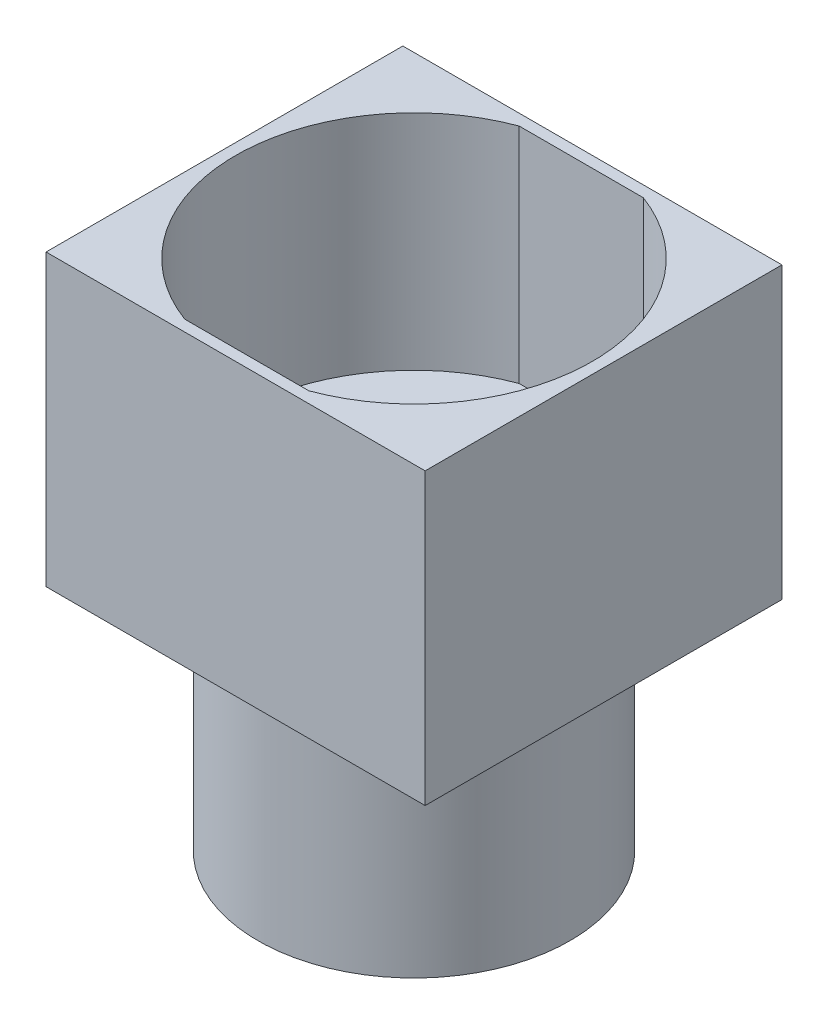
ISO-10303-21;
HEADER;
FILE_DESCRIPTION(('STEP AP214'),'2;1');
FILE_NAME('part.step','',(''),(''),'','','');
FILE_SCHEMA(('AUTOMOTIVE_DESIGN { 1 0 10303 214 1 1 1 1 }'));
ENDSEC;
DATA;
#1=APPLICATION_CONTEXT('core data for automotive mechanical design processes');
#2=APPLICATION_PROTOCOL_DEFINITION('international standard','automotive_design',2000,#1);
#3=PRODUCT_CONTEXT('',#1,'mechanical');
#4=PRODUCT('Part','Part','',(#3));
#5=PRODUCT_RELATED_PRODUCT_CATEGORY('part','',(#4));
#6=PRODUCT_DEFINITION_FORMATION('','',#4);
#7=PRODUCT_DEFINITION_CONTEXT('part definition',#1,'design');
#8=PRODUCT_DEFINITION('design','',#6,#7);
#9=PRODUCT_DEFINITION_SHAPE('','',#8);
#10=(LENGTH_UNIT() NAMED_UNIT(*) SI_UNIT(.MILLI.,.METRE.));
#11=(NAMED_UNIT(*) PLANE_ANGLE_UNIT() SI_UNIT($,.RADIAN.));
#12=(NAMED_UNIT(*) SI_UNIT($,.STERADIAN.) SOLID_ANGLE_UNIT());
#13=UNCERTAINTY_MEASURE_WITH_UNIT(LENGTH_MEASURE(1.E-05),#10,'distance_accuracy_value','');
#14=(GEOMETRIC_REPRESENTATION_CONTEXT(3) GLOBAL_UNCERTAINTY_ASSIGNED_CONTEXT((#13)) GLOBAL_UNIT_ASSIGNED_CONTEXT((#10,
#11,#12)) REPRESENTATION_CONTEXT('',''));
#15=CARTESIAN_POINT('',(0.,0.,0.));
#16=DIRECTION('',(0.,0.,1.));
#17=DIRECTION('',(1.,0.,0.));
#18=AXIS2_PLACEMENT_3D('',#15,#16,#17);
#19=CARTESIAN_POINT('',(0.,13.,0.));
#20=DIRECTION('',(0.,-1.,0.));
#21=DIRECTION('',(0.,0.,-1.));
#22=AXIS2_PLACEMENT_3D('',#19,#20,#21);
#23=CYLINDRICAL_SURFACE('',#22,7.);
#24=CARTESIAN_POINT('',(0.,0.,0.));
#25=DIRECTION('',(0.,1.,0.));
#26=DIRECTION('',(0.,0.,1.));
#27=AXIS2_PLACEMENT_3D('',#24,#25,#26);
#28=CIRCLE('',#27,7.);
#29=CARTESIAN_POINT('',(0.,0.,-7.));
#30=VERTEX_POINT('',#29);
#31=EDGE_CURVE('E38',#30,#30,#28,.T.);
#32=CARTESIAN_POINT('',(0.,10.,0.));
#33=DIRECTION('',(0.,1.,0.));
#34=DIRECTION('',(0.,0.,1.));
#35=AXIS2_PLACEMENT_3D('',#32,#33,#34);
#36=CIRCLE('',#35,7.);
#37=CARTESIAN_POINT('',(0.,10.,-7.));
#38=VERTEX_POINT('',#37);
#39=EDGE_CURVE('E11',#38,#38,#36,.T.);
#40=CARTESIAN_POINT('',(0.,0.,-7.));
#41=CARTESIAN_POINT('',(0.,0.104166666666667,-7.));
#42=CARTESIAN_POINT('',(0.,0.208333333333334,-7.));
#43=CARTESIAN_POINT('',(0.,0.416666666666667,-7.));
#44=CARTESIAN_POINT('',(0.,0.520833333333334,-7.));
#45=CARTESIAN_POINT('',(0.,0.729166666666667,-7.));
#46=CARTESIAN_POINT('',(0.,0.833333333333333,-7.));
#47=CARTESIAN_POINT('',(0.,1.04166666666667,-7.));
#48=CARTESIAN_POINT('',(0.,1.14583333333333,-7.));
#49=CARTESIAN_POINT('',(0.,1.35416666666667,-7.));
#50=CARTESIAN_POINT('',(0.,1.45833333333333,-7.));
#51=CARTESIAN_POINT('',(0.,1.66666666666667,-7.));
#52=CARTESIAN_POINT('',(0.,1.77083333333333,-7.));
#53=CARTESIAN_POINT('',(0.,1.97916666666667,-7.));
#54=CARTESIAN_POINT('',(0.,2.08333333333333,-7.));
#55=CARTESIAN_POINT('',(0.,2.29166666666667,-7.));
#56=CARTESIAN_POINT('',(0.,2.39583333333333,-7.));
#57=CARTESIAN_POINT('',(0.,2.60416666666667,-7.));
#58=CARTESIAN_POINT('',(0.,2.70833333333333,-7.));
#59=CARTESIAN_POINT('',(0.,2.91666666666667,-7.));
#60=CARTESIAN_POINT('',(0.,3.02083333333333,-7.));
#61=CARTESIAN_POINT('',(0.,3.22916666666667,-7.));
#62=CARTESIAN_POINT('',(0.,3.33333333333333,-7.));
#63=CARTESIAN_POINT('',(0.,3.54166666666667,-7.));
#64=CARTESIAN_POINT('',(0.,3.64583333333333,-7.));
#65=CARTESIAN_POINT('',(0.,3.85416666666667,-7.));
#66=CARTESIAN_POINT('',(0.,3.95833333333333,-7.));
#67=CARTESIAN_POINT('',(0.,4.16666666666667,-7.));
#68=CARTESIAN_POINT('',(0.,4.27083333333333,-7.));
#69=CARTESIAN_POINT('',(0.,4.47916666666667,-7.));
#70=CARTESIAN_POINT('',(0.,4.58333333333333,-7.));
#71=CARTESIAN_POINT('',(0.,4.79166666666667,-7.));
#72=CARTESIAN_POINT('',(0.,4.89583333333333,-7.));
#73=CARTESIAN_POINT('',(0.,5.10416666666667,-7.));
#74=CARTESIAN_POINT('',(0.,5.20833333333333,-7.));
#75=CARTESIAN_POINT('',(0.,5.41666666666667,-7.));
#76=CARTESIAN_POINT('',(0.,5.52083333333333,-7.));
#77=CARTESIAN_POINT('',(0.,5.72916666666666,-7.));
#78=CARTESIAN_POINT('',(0.,5.83333333333333,-7.));
#79=CARTESIAN_POINT('',(0.,6.04166666666667,-7.));
#80=CARTESIAN_POINT('',(0.,6.14583333333333,-7.));
#81=CARTESIAN_POINT('',(0.,6.35416666666666,-7.));
#82=CARTESIAN_POINT('',(0.,6.45833333333333,-7.));
#83=CARTESIAN_POINT('',(0.,6.66666666666666,-7.));
#84=CARTESIAN_POINT('',(0.,6.77083333333333,-7.));
#85=CARTESIAN_POINT('',(0.,6.97916666666667,-7.));
#86=CARTESIAN_POINT('',(0.,7.08333333333333,-7.));
#87=CARTESIAN_POINT('',(0.,7.29166666666666,-7.));
#88=CARTESIAN_POINT('',(0.,7.39583333333333,-7.));
#89=CARTESIAN_POINT('',(0.,7.60416666666666,-7.));
#90=CARTESIAN_POINT('',(0.,7.70833333333333,-7.));
#91=CARTESIAN_POINT('',(0.,7.91666666666666,-7.));
#92=CARTESIAN_POINT('',(0.,8.02083333333333,-7.));
#93=CARTESIAN_POINT('',(0.,8.22916666666666,-7.));
#94=CARTESIAN_POINT('',(0.,8.33333333333333,-7.));
#95=CARTESIAN_POINT('',(0.,8.54166666666666,-7.));
#96=CARTESIAN_POINT('',(0.,8.64583333333333,-7.));
#97=CARTESIAN_POINT('',(0.,8.85416666666666,-7.));
#98=CARTESIAN_POINT('',(0.,8.95833333333333,-7.));
#99=CARTESIAN_POINT('',(0.,9.16666666666666,-7.));
#100=CARTESIAN_POINT('',(0.,9.27083333333333,-7.));
#101=CARTESIAN_POINT('',(0.,9.47916666666666,-7.));
#102=CARTESIAN_POINT('',(0.,9.58333333333333,-7.));
#103=CARTESIAN_POINT('',(0.,9.79166666666666,-7.));
#104=CARTESIAN_POINT('',(0.,9.89583333333333,-7.));
#105=CARTESIAN_POINT('',(0.,10.,-7.));
#106=B_SPLINE_CURVE_WITH_KNOTS('',3,(#40,#41,#42,#43,#44,#45,#46,#47,#48,#49,#50,#51,#52,#53,
#54,#55,#56,#57,#58,#59,#60,#61,#62,#63,#64,#65,#66,#67,#68,#69,#70,#71,#72,#73,#74,#75,#76,#77,
#78,#79,#80,#81,#82,#83,#84,#85,#86,#87,#88,#89,#90,#91,#92,#93,#94,#95,#96,#97,#98,#99,#100,
#101,#102,#103,#104,#105),.UNSPECIFIED.,.F.,.F.,(4,2,2,2,2,2,2,2,2,2,2,2,2,2,2,2,2,2,2,2,2,2,2,
2,2,2,2,2,2,2,2,2,4),(0.,0.3125,0.625000000000001,0.937499999999999,1.25,1.5625,1.875,2.1875,
2.5,2.8125,3.125,3.4375,3.75,4.0625,4.375,4.6875,5.,5.3125,5.625,5.9375,6.25,6.5625,6.875,
7.1875,7.5,7.8125,8.125,8.4375,8.75,9.0625,9.375,9.6875,10.),.UNSPECIFIED.);
#107=EDGE_CURVE('BSEAM35',#30,#38,#106,.T.);
#108=ORIENTED_EDGE('',*,*,#31,.T.);
#109=ORIENTED_EDGE('',*,*,#39,.F.);
#110=ORIENTED_EDGE('',*,*,#107,.T.);
#111=ORIENTED_EDGE('',*,*,#107,.F.);
#112=EDGE_LOOP('',(#108,#110,#109,#111));
#113=FACE_BOUND('',#112,.T.);
#114=ADVANCED_FACE('F35',(#113),#23,.T.);
#115=CARTESIAN_POINT('',(0.,13.,0.));
#116=DIRECTION('',(0.,-1.,0.));
#117=DIRECTION('',(0.,0.,-1.));
#118=AXIS2_PLACEMENT_3D('',#115,#116,#117);
#119=CYLINDRICAL_SURFACE('',#118,4.);
#120=CARTESIAN_POINT('',(0.,0.,0.));
#121=DIRECTION('',(0.,1.,0.));
#122=DIRECTION('',(0.,0.,1.));
#123=AXIS2_PLACEMENT_3D('',#120,#121,#122);
#124=CIRCLE('',#123,4.);
#125=CARTESIAN_POINT('',(0.,0.,-4.));
#126=VERTEX_POINT('',#125);
#127=EDGE_CURVE('E174',#126,#126,#124,.T.);
#128=CARTESIAN_POINT('',(0.,13.,0.));
#129=DIRECTION('',(0.,1.,0.));
#130=DIRECTION('',(0.,0.,1.));
#131=AXIS2_PLACEMENT_3D('',#128,#129,#130);
#132=CIRCLE('',#131,4.);
#133=CARTESIAN_POINT('',(0.,13.,-4.));
#134=VERTEX_POINT('',#133);
#135=EDGE_CURVE('E111',#134,#134,#132,.T.);
#136=CARTESIAN_POINT('',(0.,0.,-4.));
#137=CARTESIAN_POINT('',(0.,0.135416666666667,-4.));
#138=CARTESIAN_POINT('',(0.,0.270833333333334,-4.));
#139=CARTESIAN_POINT('',(0.,0.541666666666667,-4.));
#140=CARTESIAN_POINT('',(0.,0.677083333333334,-4.));
#141=CARTESIAN_POINT('',(0.,0.947916666666667,-4.));
#142=CARTESIAN_POINT('',(0.,1.08333333333333,-4.));
#143=CARTESIAN_POINT('',(0.,1.35416666666667,-4.));
#144=CARTESIAN_POINT('',(0.,1.48958333333333,-4.));
#145=CARTESIAN_POINT('',(0.,1.76041666666667,-4.));
#146=CARTESIAN_POINT('',(0.,1.89583333333333,-4.));
#147=CARTESIAN_POINT('',(0.,2.16666666666667,-4.));
#148=CARTESIAN_POINT('',(0.,2.30208333333333,-4.));
#149=CARTESIAN_POINT('',(0.,2.57291666666667,-4.));
#150=CARTESIAN_POINT('',(0.,2.70833333333333,-4.));
#151=CARTESIAN_POINT('',(0.,2.97916666666667,-4.));
#152=CARTESIAN_POINT('',(0.,3.11458333333333,-4.));
#153=CARTESIAN_POINT('',(0.,3.38541666666667,-4.));
#154=CARTESIAN_POINT('',(0.,3.52083333333333,-4.));
#155=CARTESIAN_POINT('',(0.,3.79166666666667,-4.));
#156=CARTESIAN_POINT('',(0.,3.92708333333333,-4.));
#157=CARTESIAN_POINT('',(0.,4.19791666666667,-4.));
#158=CARTESIAN_POINT('',(0.,4.33333333333333,-4.));
#159=CARTESIAN_POINT('',(0.,4.60416666666667,-4.));
#160=CARTESIAN_POINT('',(0.,4.73958333333333,-4.));
#161=CARTESIAN_POINT('',(0.,5.01041666666667,-4.));
#162=CARTESIAN_POINT('',(0.,5.14583333333333,-4.));
#163=CARTESIAN_POINT('',(0.,5.41666666666667,-4.));
#164=CARTESIAN_POINT('',(0.,5.55208333333333,-4.));
#165=CARTESIAN_POINT('',(0.,5.82291666666667,-4.));
#166=CARTESIAN_POINT('',(0.,5.95833333333333,-4.));
#167=CARTESIAN_POINT('',(0.,6.22916666666667,-4.));
#168=CARTESIAN_POINT('',(0.,6.36458333333333,-4.));
#169=CARTESIAN_POINT('',(0.,6.63541666666667,-4.));
#170=CARTESIAN_POINT('',(0.,6.77083333333333,-4.));
#171=CARTESIAN_POINT('',(0.,7.04166666666667,-4.));
#172=CARTESIAN_POINT('',(0.,7.17708333333333,-4.));
#173=CARTESIAN_POINT('',(0.,7.44791666666667,-4.));
#174=CARTESIAN_POINT('',(0.,7.58333333333333,-4.));
#175=CARTESIAN_POINT('',(0.,7.85416666666667,-4.));
#176=CARTESIAN_POINT('',(0.,7.98958333333333,-4.));
#177=CARTESIAN_POINT('',(0.,8.26041666666667,-4.));
#178=CARTESIAN_POINT('',(0.,8.39583333333333,-4.));
#179=CARTESIAN_POINT('',(0.,8.66666666666666,-4.));
#180=CARTESIAN_POINT('',(0.,8.80208333333333,-4.));
#181=CARTESIAN_POINT('',(0.,9.07291666666666,-4.));
#182=CARTESIAN_POINT('',(0.,9.20833333333333,-4.));
#183=CARTESIAN_POINT('',(0.,9.47916666666667,-4.));
#184=CARTESIAN_POINT('',(0.,9.61458333333333,-4.));
#185=CARTESIAN_POINT('',(0.,9.88541666666667,-4.));
#186=CARTESIAN_POINT('',(0.,10.0208333333333,-4.));
#187=CARTESIAN_POINT('',(0.,10.2916666666667,-4.));
#188=CARTESIAN_POINT('',(0.,10.4270833333333,-4.));
#189=CARTESIAN_POINT('',(0.,10.6979166666667,-4.));
#190=CARTESIAN_POINT('',(0.,10.8333333333333,-4.));
#191=CARTESIAN_POINT('',(0.,11.1041666666667,-4.));
#192=CARTESIAN_POINT('',(0.,11.2395833333333,-4.));
#193=CARTESIAN_POINT('',(0.,11.5104166666667,-4.));
#194=CARTESIAN_POINT('',(0.,11.6458333333333,-4.));
#195=CARTESIAN_POINT('',(0.,11.9166666666667,-4.));
#196=CARTESIAN_POINT('',(0.,12.0520833333333,-4.));
#197=CARTESIAN_POINT('',(0.,12.3229166666667,-4.));
#198=CARTESIAN_POINT('',(0.,12.4583333333333,-4.));
#199=CARTESIAN_POINT('',(0.,12.7291666666667,-4.));
#200=CARTESIAN_POINT('',(0.,12.8645833333333,-4.));
#201=CARTESIAN_POINT('',(0.,13.,-4.));
#202=B_SPLINE_CURVE_WITH_KNOTS('',3,(#136,#137,#138,#139,#140,#141,#142,#143,#144,#145,#146,
#147,#148,#149,#150,#151,#152,#153,#154,#155,#156,#157,#158,#159,#160,#161,#162,#163,#164,#165,
#166,#167,#168,#169,#170,#171,#172,#173,#174,#175,#176,#177,#178,#179,#180,#181,#182,#183,#184,
#185,#186,#187,#188,#189,#190,#191,#192,#193,#194,#195,#196,#197,#198,#199,#200,#201),
.UNSPECIFIED.,.F.,.F.,(4,2,2,2,2,2,2,2,2,2,2,2,2,2,2,2,2,2,2,2,2,2,2,2,2,2,2,2,2,2,2,2,4),(0.,
0.40625,0.812500000000001,1.21875,1.625,2.03125,2.4375,2.84375,3.25,3.65625,4.0625,4.46875,
4.875,5.28125,5.6875,6.09375,6.5,6.90625,7.3125,7.71875,8.125,8.53125,8.9375,9.34375,9.75,
10.15625,10.5625,10.96875,11.375,11.78125,12.1875,12.59375,13.),.UNSPECIFIED.);
#203=EDGE_CURVE('BSEAM186',#126,#134,#202,.T.);
#204=ORIENTED_EDGE('',*,*,#127,.F.);
#205=ORIENTED_EDGE('',*,*,#135,.T.);
#206=ORIENTED_EDGE('',*,*,#203,.T.);
#207=ORIENTED_EDGE('',*,*,#203,.F.);
#208=EDGE_LOOP('',(#204,#206,#205,#207));
#209=FACE_BOUND('',#208,.T.);
#210=ADVANCED_FACE('F186',(#209),#119,.F.);
#211=CARTESIAN_POINT('',(0.,0.,0.));
#212=DIRECTION('',(0.,1.,0.));
#213=DIRECTION('',(0.,0.,1.));
#214=AXIS2_PLACEMENT_3D('',#211,#212,#213);
#215=PLANE('',#214);
#216=ORIENTED_EDGE('',*,*,#31,.F.);
#217=EDGE_LOOP('',(#216));
#218=FACE_BOUND('',#217,.T.);
#219=ORIENTED_EDGE('',*,*,#127,.T.);
#220=EDGE_LOOP('',(#219));
#221=FACE_BOUND('',#220,.T.);
#222=ADVANCED_FACE('F183',(#218,#221),#215,.F.);
#223=CARTESIAN_POINT('',(-8.5,13.,-8.));
#224=DIRECTION('',(1.,0.,0.));
#225=DIRECTION('',(0.,0.,-1.));
#226=AXIS2_PLACEMENT_3D('',#223,#224,#225);
#227=PLANE('',#226);
#228=DIRECTION('',(0.,0.,1.));
#229=VECTOR('',#228,1.);
#230=CARTESIAN_POINT('',(-8.5,10.,-8.));
#231=LINE('',#230,#229);
#232=CARTESIAN_POINT('',(-8.5,10.,-8.));
#233=VERTEX_POINT('',#232);
#234=CARTESIAN_POINT('',(-8.5,10.,8.));
#235=VERTEX_POINT('',#234);
#236=EDGE_CURVE('E157',#233,#235,#231,.T.);
#237=ORIENTED_EDGE('',*,*,#236,.T.);
#238=DIRECTION('',(0.,-1.,0.));
#239=VECTOR('',#238,1.);
#240=CARTESIAN_POINT('',(-8.5,13.,8.));
#241=LINE('',#240,#239);
#242=CARTESIAN_POINT('',(-8.5,23.,8.));
#243=VERTEX_POINT('',#242);
#244=EDGE_CURVE('E172',#243,#235,#241,.T.);
#245=ORIENTED_EDGE('',*,*,#244,.F.);
#246=DIRECTION('',(0.,0.,1.));
#247=VECTOR('',#246,1.);
#248=CARTESIAN_POINT('',(-8.5,23.,0.));
#249=LINE('',#248,#247);
#250=CARTESIAN_POINT('',(-8.5,23.,-8.));
#251=VERTEX_POINT('',#250);
#252=EDGE_CURVE('E135',#251,#243,#249,.T.);
#253=ORIENTED_EDGE('',*,*,#252,.F.);
#254=DIRECTION('',(0.,-1.,0.));
#255=VECTOR('',#254,1.);
#256=CARTESIAN_POINT('',(-8.5,13.,-8.));
#257=LINE('',#256,#255);
#258=EDGE_CURVE('E165',#251,#233,#257,.T.);
#259=ORIENTED_EDGE('',*,*,#258,.T.);
#260=EDGE_LOOP('',(#237,#245,#253,#259));
#261=FACE_BOUND('',#260,.T.);
#262=ADVANCED_FACE('F185',(#261),#227,.F.);
#263=CARTESIAN_POINT('',(-8.5,13.,8.));
#264=DIRECTION('',(0.,0.,-1.));
#265=DIRECTION('',(-1.,0.,0.));
#266=AXIS2_PLACEMENT_3D('',#263,#264,#265);
#267=PLANE('',#266);
#268=DIRECTION('',(1.,0.,0.));
#269=VECTOR('',#268,1.);
#270=CARTESIAN_POINT('',(-8.5,10.,8.));
#271=LINE('',#270,#269);
#272=CARTESIAN_POINT('',(8.5,10.,8.));
#273=VERTEX_POINT('',#272);
#274=EDGE_CURVE('E160',#235,#273,#271,.T.);
#275=ORIENTED_EDGE('',*,*,#274,.T.);
#276=DIRECTION('',(0.,-1.,0.));
#277=VECTOR('',#276,1.);
#278=CARTESIAN_POINT('',(8.5,13.,8.));
#279=LINE('',#278,#277);
#280=CARTESIAN_POINT('',(8.5,23.,8.));
#281=VERTEX_POINT('',#280);
#282=EDGE_CURVE('E169',#281,#273,#279,.T.);
#283=ORIENTED_EDGE('',*,*,#282,.F.);
#284=DIRECTION('',(1.,0.,0.));
#285=VECTOR('',#284,1.);
#286=CARTESIAN_POINT('',(0.,23.,8.));
#287=LINE('',#286,#285);
#288=EDGE_CURVE('E138',#243,#281,#287,.T.);
#289=ORIENTED_EDGE('',*,*,#288,.F.);
#290=ORIENTED_EDGE('',*,*,#244,.T.);
#291=EDGE_LOOP('',(#275,#283,#289,#290));
#292=FACE_BOUND('',#291,.T.);
#293=ADVANCED_FACE('F191',(#292),#267,.F.);
#294=CARTESIAN_POINT('',(8.5,13.,-8.));
#295=DIRECTION('',(-1.,0.,0.));
#296=DIRECTION('',(0.,0.,1.));
#297=AXIS2_PLACEMENT_3D('',#294,#295,#296);
#298=PLANE('',#297);
#299=DIRECTION('',(0.,0.,-1.));
#300=VECTOR('',#299,1.);
#301=CARTESIAN_POINT('',(8.5,10.,-8.));
#302=LINE('',#301,#300);
#303=CARTESIAN_POINT('',(8.5,10.,-8.));
#304=VERTEX_POINT('',#303);
#305=EDGE_CURVE('E162',#273,#304,#302,.T.);
#306=ORIENTED_EDGE('',*,*,#305,.T.);
#307=DIRECTION('',(0.,-1.,0.));
#308=VECTOR('',#307,1.);
#309=CARTESIAN_POINT('',(8.5,13.,-8.));
#310=LINE('',#309,#308);
#311=CARTESIAN_POINT('',(8.5,23.,-8.));
#312=VERTEX_POINT('',#311);
#313=EDGE_CURVE('E167',#312,#304,#310,.T.);
#314=ORIENTED_EDGE('',*,*,#313,.F.);
#315=DIRECTION('',(0.,0.,-1.));
#316=VECTOR('',#315,1.);
#317=CARTESIAN_POINT('',(8.5,23.,0.));
#318=LINE('',#317,#316);
#319=EDGE_CURVE('E141',#281,#312,#318,.T.);
#320=ORIENTED_EDGE('',*,*,#319,.F.);
#321=ORIENTED_EDGE('',*,*,#282,.T.);
#322=EDGE_LOOP('',(#306,#314,#320,#321));
#323=FACE_BOUND('',#322,.T.);
#324=ADVANCED_FACE('F228',(#323),#298,.F.);
#325=CARTESIAN_POINT('',(-8.5,13.,-8.));
#326=DIRECTION('',(0.,0.,1.));
#327=DIRECTION('',(1.,0.,0.));
#328=AXIS2_PLACEMENT_3D('',#325,#326,#327);
#329=PLANE('',#328);
#330=DIRECTION('',(-1.,0.,0.));
#331=VECTOR('',#330,1.);
#332=CARTESIAN_POINT('',(-8.5,10.,-8.));
#333=LINE('',#332,#331);
#334=EDGE_CURVE('E58',#304,#233,#333,.T.);
#335=ORIENTED_EDGE('',*,*,#334,.T.);
#336=ORIENTED_EDGE('',*,*,#258,.F.);
#337=DIRECTION('',(-1.,0.,0.));
#338=VECTOR('',#337,1.);
#339=CARTESIAN_POINT('',(0.,23.,-8.));
#340=LINE('',#339,#338);
#341=EDGE_CURVE('E132',#312,#251,#340,.T.);
#342=ORIENTED_EDGE('',*,*,#341,.F.);
#343=ORIENTED_EDGE('',*,*,#313,.T.);
#344=EDGE_LOOP('',(#335,#336,#342,#343));
#345=FACE_BOUND('',#344,.T.);
#346=ADVANCED_FACE('F238',(#345),#329,.F.);
#347=CARTESIAN_POINT('',(0.,10.,0.));
#348=DIRECTION('',(0.,1.,0.));
#349=DIRECTION('',(0.,0.,1.));
#350=AXIS2_PLACEMENT_3D('',#347,#348,#349);
#351=PLANE('',#350);
#352=ORIENTED_EDGE('',*,*,#39,.T.);
#353=EDGE_LOOP('',(#352));
#354=FACE_BOUND('',#353,.T.);
#355=ORIENTED_EDGE('',*,*,#236,.F.);
#356=ORIENTED_EDGE('',*,*,#334,.F.);
#357=ORIENTED_EDGE('',*,*,#305,.F.);
#358=ORIENTED_EDGE('',*,*,#274,.F.);
#359=EDGE_LOOP('',(#355,#356,#357,#358));
#360=FACE_BOUND('',#359,.T.);
#361=ADVANCED_FACE('F213',(#354,#360),#351,.F.);
#362=CARTESIAN_POINT('',(0.,13.,0.));
#363=DIRECTION('',(0.,1.,0.));
#364=DIRECTION('',(0.,0.,1.));
#365=AXIS2_PLACEMENT_3D('',#362,#363,#364);
#366=PLANE('',#365);
#367=CARTESIAN_POINT('',(0.,13.,0.));
#368=DIRECTION('',(0.,1.,0.));
#369=DIRECTION('',(0.,0.,1.));
#370=AXIS2_PLACEMENT_3D('',#367,#368,#369);
#371=CIRCLE('',#370,8.);
#372=CARTESIAN_POINT('',(2.78388218141502,13.,7.5));
#373=VERTEX_POINT('',#372);
#374=CARTESIAN_POINT('',(2.78388218141501,13.,-7.5));
#375=VERTEX_POINT('',#374);
#376=EDGE_CURVE('E106',#373,#375,#371,.T.);
#377=ORIENTED_EDGE('',*,*,#376,.T.);
#378=DIRECTION('',(1.,0.,0.));
#379=VECTOR('',#378,1.);
#380=CARTESIAN_POINT('',(0.,13.,-7.5));
#381=LINE('',#380,#379);
#382=CARTESIAN_POINT('',(-2.78388218141501,13.,-7.5));
#383=VERTEX_POINT('',#382);
#384=EDGE_CURVE('E124',#383,#375,#381,.T.);
#385=ORIENTED_EDGE('',*,*,#384,.F.);
#386=CARTESIAN_POINT('',(0.,13.,0.));
#387=DIRECTION('',(0.,1.,0.));
#388=DIRECTION('',(0.,0.,1.));
#389=AXIS2_PLACEMENT_3D('',#386,#387,#388);
#390=CIRCLE('',#389,8.);
#391=CARTESIAN_POINT('',(-2.78388218141502,13.,7.5));
#392=VERTEX_POINT('',#391);
#393=EDGE_CURVE('E50',#383,#392,#390,.T.);
#394=ORIENTED_EDGE('',*,*,#393,.T.);
#395=DIRECTION('',(1.,0.,0.));
#396=VECTOR('',#395,1.);
#397=CARTESIAN_POINT('',(0.,13.,7.5));
#398=LINE('',#397,#396);
#399=EDGE_CURVE('E146',#392,#373,#398,.T.);
#400=ORIENTED_EDGE('',*,*,#399,.T.);
#401=EDGE_LOOP('',(#377,#385,#394,#400));
#402=FACE_BOUND('',#401,.T.);
#403=ORIENTED_EDGE('',*,*,#135,.F.);
#404=EDGE_LOOP('',(#403));
#405=FACE_BOUND('',#404,.T.);
#406=ADVANCED_FACE('F255',(#402,#405),#366,.T.);
#407=CARTESIAN_POINT('',(0.,23.,0.));
#408=DIRECTION('',(0.,-1.,0.));
#409=DIRECTION('',(0.,0.,-1.));
#410=AXIS2_PLACEMENT_3D('',#407,#408,#409);
#411=CYLINDRICAL_SURFACE('',#410,8.);
#412=ORIENTED_EDGE('',*,*,#376,.F.);
#413=DIRECTION('',(0.,-1.,0.));
#414=VECTOR('',#413,1.);
#415=CARTESIAN_POINT('',(2.78388218141502,23.,7.5));
#416=LINE('',#415,#414);
#417=CARTESIAN_POINT('',(2.78388218141502,23.,7.5));
#418=VERTEX_POINT('',#417);
#419=EDGE_CURVE('E101',#418,#373,#416,.T.);
#420=ORIENTED_EDGE('',*,*,#419,.F.);
#421=CARTESIAN_POINT('',(0.,23.,0.));
#422=DIRECTION('',(0.,1.,0.));
#423=DIRECTION('',(0.,0.,1.));
#424=AXIS2_PLACEMENT_3D('',#421,#422,#423);
#425=CIRCLE('',#424,8.);
#426=CARTESIAN_POINT('',(2.78388218141501,23.,-7.5));
#427=VERTEX_POINT('',#426);
#428=EDGE_CURVE('E104',#418,#427,#425,.T.);
#429=ORIENTED_EDGE('',*,*,#428,.T.);
#430=DIRECTION('',(0.,-1.,0.));
#431=VECTOR('',#430,1.);
#432=CARTESIAN_POINT('',(2.78388218141501,23.,-7.5));
#433=LINE('',#432,#431);
#434=EDGE_CURVE('E144',#427,#375,#433,.T.);
#435=ORIENTED_EDGE('',*,*,#434,.T.);
#436=EDGE_LOOP('',(#412,#420,#429,#435));
#437=FACE_BOUND('',#436,.T.);
#438=ADVANCED_FACE('F103',(#437),#411,.F.);
#439=CARTESIAN_POINT('',(0.,23.,7.5));
#440=DIRECTION('',(0.,0.,-1.));
#441=DIRECTION('',(-1.,0.,0.));
#442=AXIS2_PLACEMENT_3D('',#439,#440,#441);
#443=PLANE('',#442);
#444=ORIENTED_EDGE('',*,*,#399,.F.);
#445=DIRECTION('',(0.,-1.,0.));
#446=VECTOR('',#445,1.);
#447=CARTESIAN_POINT('',(-2.78388218141502,23.,7.5));
#448=LINE('',#447,#446);
#449=CARTESIAN_POINT('',(-2.78388218141502,23.,7.5));
#450=VERTEX_POINT('',#449);
#451=EDGE_CURVE('E112',#450,#392,#448,.T.);
#452=ORIENTED_EDGE('',*,*,#451,.F.);
#453=DIRECTION('',(1.,0.,0.));
#454=VECTOR('',#453,1.);
#455=CARTESIAN_POINT('',(0.,23.,7.5));
#456=LINE('',#455,#454);
#457=EDGE_CURVE('E119',#450,#418,#456,.T.);
#458=ORIENTED_EDGE('',*,*,#457,.T.);
#459=ORIENTED_EDGE('',*,*,#419,.T.);
#460=EDGE_LOOP('',(#444,#452,#458,#459));
#461=FACE_BOUND('',#460,.T.);
#462=ADVANCED_FACE('F126',(#461),#443,.T.);
#463=CARTESIAN_POINT('',(0.,23.,0.));
#464=DIRECTION('',(0.,-1.,0.));
#465=DIRECTION('',(0.,0.,-1.));
#466=AXIS2_PLACEMENT_3D('',#463,#464,#465);
#467=CYLINDRICAL_SURFACE('',#466,8.);
#468=ORIENTED_EDGE('',*,*,#393,.F.);
#469=DIRECTION('',(0.,-1.,0.));
#470=VECTOR('',#469,1.);
#471=CARTESIAN_POINT('',(-2.78388218141501,23.,-7.5));
#472=LINE('',#471,#470);
#473=CARTESIAN_POINT('',(-2.78388218141501,23.,-7.5));
#474=VERTEX_POINT('',#473);
#475=EDGE_CURVE('E152',#474,#383,#472,.T.);
#476=ORIENTED_EDGE('',*,*,#475,.F.);
#477=CARTESIAN_POINT('',(0.,23.,0.));
#478=DIRECTION('',(0.,1.,0.));
#479=DIRECTION('',(0.,0.,1.));
#480=AXIS2_PLACEMENT_3D('',#477,#478,#479);
#481=CIRCLE('',#480,8.);
#482=EDGE_CURVE('E127',#474,#450,#481,.T.);
#483=ORIENTED_EDGE('',*,*,#482,.T.);
#484=ORIENTED_EDGE('',*,*,#451,.T.);
#485=EDGE_LOOP('',(#468,#476,#483,#484));
#486=FACE_BOUND('',#485,.T.);
#487=ADVANCED_FACE('F275',(#486),#467,.F.);
#488=CARTESIAN_POINT('',(0.,23.,-7.5));
#489=DIRECTION('',(0.,0.,-1.));
#490=DIRECTION('',(-1.,0.,0.));
#491=AXIS2_PLACEMENT_3D('',#488,#489,#490);
#492=PLANE('',#491);
#493=ORIENTED_EDGE('',*,*,#384,.T.);
#494=ORIENTED_EDGE('',*,*,#434,.F.);
#495=DIRECTION('',(1.,0.,0.));
#496=VECTOR('',#495,1.);
#497=CARTESIAN_POINT('',(0.,23.,-7.5));
#498=LINE('',#497,#496);
#499=EDGE_CURVE('E122',#474,#427,#498,.T.);
#500=ORIENTED_EDGE('',*,*,#499,.F.);
#501=ORIENTED_EDGE('',*,*,#475,.T.);
#502=EDGE_LOOP('',(#493,#494,#500,#501));
#503=FACE_BOUND('',#502,.T.);
#504=ADVANCED_FACE('F284',(#503),#492,.F.);
#505=CARTESIAN_POINT('',(0.,23.,0.));
#506=DIRECTION('',(0.,1.,0.));
#507=DIRECTION('',(0.,0.,1.));
#508=AXIS2_PLACEMENT_3D('',#505,#506,#507);
#509=PLANE('',#508);
#510=ORIENTED_EDGE('',*,*,#428,.F.);
#511=ORIENTED_EDGE('',*,*,#457,.F.);
#512=ORIENTED_EDGE('',*,*,#482,.F.);
#513=ORIENTED_EDGE('',*,*,#499,.T.);
#514=EDGE_LOOP('',(#510,#511,#512,#513));
#515=FACE_BOUND('',#514,.T.);
#516=ORIENTED_EDGE('',*,*,#341,.T.);
#517=ORIENTED_EDGE('',*,*,#252,.T.);
#518=ORIENTED_EDGE('',*,*,#288,.T.);
#519=ORIENTED_EDGE('',*,*,#319,.T.);
#520=EDGE_LOOP('',(#516,#517,#518,#519));
#521=FACE_BOUND('',#520,.T.);
#522=ADVANCED_FACE('F116',(#515,#521),#509,.T.);
#523=CLOSED_SHELL('',(#114,#210,#222,#262,#293,#324,#346,#361,#406,#438,#462,#487,#504,#522));
#524=MANIFOLD_SOLID_BREP('B2',#523);
#525=ADVANCED_BREP_SHAPE_REPRESENTATION('',(#18,#524),#14);
#526=SHAPE_DEFINITION_REPRESENTATION(#9,#525);
ENDSEC;
END-ISO-10303-21;
